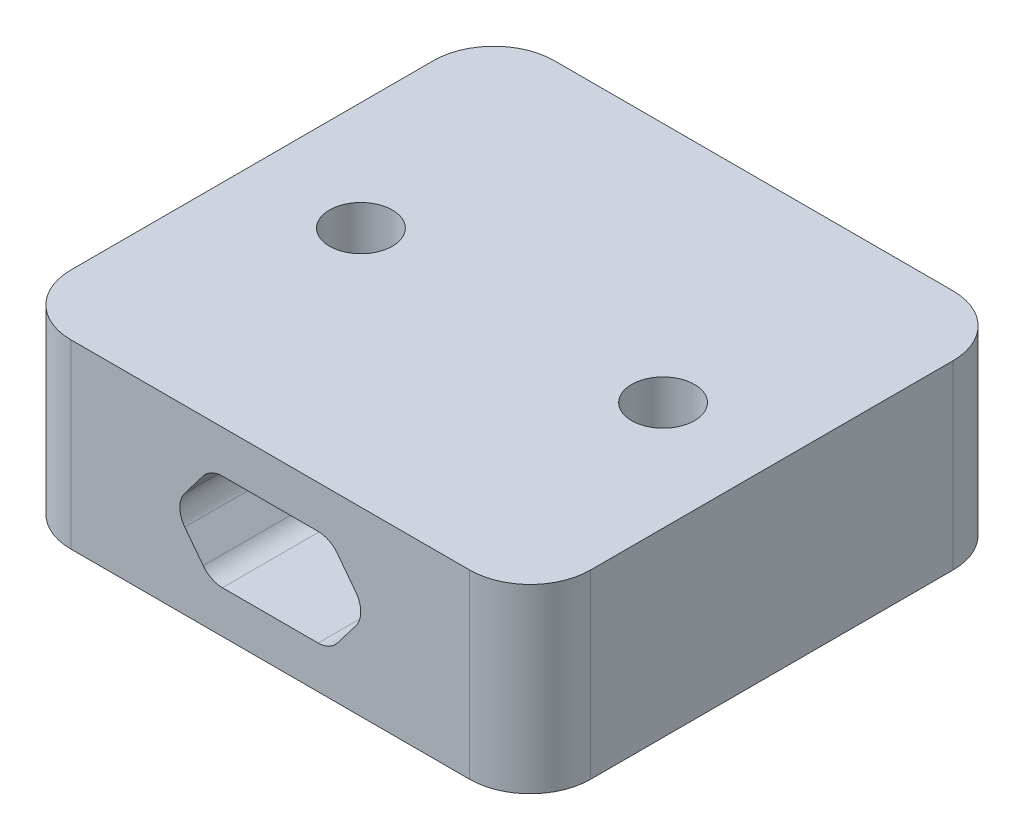
ISO-10303-21;
HEADER;
FILE_DESCRIPTION(('STEP AP214'),'2;1');
FILE_NAME('part.step','',(''),(''),'','','');
FILE_SCHEMA(('AUTOMOTIVE_DESIGN { 1 0 10303 214 1 1 1 1 }'));
ENDSEC;
DATA;
#1=APPLICATION_CONTEXT('core data for automotive mechanical design processes');
#2=APPLICATION_PROTOCOL_DEFINITION('international standard','automotive_design',2000,#1);
#3=PRODUCT_CONTEXT('',#1,'mechanical');
#4=PRODUCT('Part','Part','',(#3));
#5=PRODUCT_RELATED_PRODUCT_CATEGORY('part','',(#4));
#6=PRODUCT_DEFINITION_FORMATION('','',#4);
#7=PRODUCT_DEFINITION_CONTEXT('part definition',#1,'design');
#8=PRODUCT_DEFINITION('design','',#6,#7);
#9=PRODUCT_DEFINITION_SHAPE('','',#8);
#10=(LENGTH_UNIT() NAMED_UNIT(*) SI_UNIT(.MILLI.,.METRE.));
#11=(NAMED_UNIT(*) PLANE_ANGLE_UNIT() SI_UNIT($,.RADIAN.));
#12=(NAMED_UNIT(*) SI_UNIT($,.STERADIAN.) SOLID_ANGLE_UNIT());
#13=UNCERTAINTY_MEASURE_WITH_UNIT(LENGTH_MEASURE(1.E-05),#10,'distance_accuracy_value','');
#14=(GEOMETRIC_REPRESENTATION_CONTEXT(3) GLOBAL_UNCERTAINTY_ASSIGNED_CONTEXT((#13)) GLOBAL_UNIT_ASSIGNED_CONTEXT((#10,
#11,#12)) REPRESENTATION_CONTEXT('',''));
#15=CARTESIAN_POINT('',(0.,0.,0.));
#16=DIRECTION('',(0.,0.,1.));
#17=DIRECTION('',(1.,0.,0.));
#18=AXIS2_PLACEMENT_3D('',#15,#16,#17);
#19=CARTESIAN_POINT('',(0.,15.,0.));
#20=DIRECTION('',(1.,0.,0.));
#21=DIRECTION('',(0.,0.,-1.));
#22=AXIS2_PLACEMENT_3D('',#19,#20,#21);
#23=PLANE('',#22);
#24=DIRECTION('',(0.,0.,1.));
#25=VECTOR('',#24,1.);
#26=CARTESIAN_POINT('',(0.,15.,0.));
#27=LINE('',#26,#25);
#28=CARTESIAN_POINT('',(0.,15.,-35.));
#29=VERTEX_POINT('',#28);
#30=CARTESIAN_POINT('',(0.,15.,-5.));
#31=VERTEX_POINT('',#30);
#32=EDGE_CURVE('E219',#29,#31,#27,.T.);
#33=ORIENTED_EDGE('',*,*,#32,.F.);
#34=DIRECTION('',(0.,-1.,0.));
#35=VECTOR('',#34,1.);
#36=CARTESIAN_POINT('',(0.,15.,-35.));
#37=LINE('',#36,#35);
#38=CARTESIAN_POINT('',(0.,0.,-35.));
#39=VERTEX_POINT('',#38);
#40=EDGE_CURVE('E11',#29,#39,#37,.T.);
#41=ORIENTED_EDGE('',*,*,#40,.T.);
#42=DIRECTION('',(0.,0.,1.));
#43=VECTOR('',#42,1.);
#44=CARTESIAN_POINT('',(0.,0.,0.));
#45=LINE('',#44,#43);
#46=CARTESIAN_POINT('',(0.,0.,-5.));
#47=VERTEX_POINT('',#46);
#48=EDGE_CURVE('E230',#39,#47,#45,.T.);
#49=ORIENTED_EDGE('',*,*,#48,.T.);
#50=DIRECTION('',(0.,-1.,0.));
#51=VECTOR('',#50,1.);
#52=CARTESIAN_POINT('',(0.,15.,-5.));
#53=LINE('',#52,#51);
#54=EDGE_CURVE('E43',#47,#31,#53,.F.);
#55=ORIENTED_EDGE('',*,*,#54,.T.);
#56=EDGE_LOOP('',(#33,#41,#49,#55));
#57=FACE_BOUND('',#56,.T.);
#58=ADVANCED_FACE('F35',(#57),#23,.F.);
#59=CARTESIAN_POINT('',(0.,15.,0.));
#60=DIRECTION('',(0.,0.,-1.));
#61=DIRECTION('',(-1.,0.,0.));
#62=AXIS2_PLACEMENT_3D('',#59,#60,#61);
#63=PLANE('',#62);
#64=DIRECTION('',(1.,0.,0.));
#65=VECTOR('',#64,1.);
#66=CARTESIAN_POINT('',(16.55,3.5,0.));
#67=LINE('',#66,#65);
#68=CARTESIAN_POINT('',(17.5400795216056,3.5,0.));
#69=VERTEX_POINT('',#68);
#70=CARTESIAN_POINT('',(25.4599204783944,3.5,0.));
#71=VERTEX_POINT('',#70);
#72=EDGE_CURVE('E191',#69,#71,#67,.T.);
#73=ORIENTED_EDGE('',*,*,#72,.F.);
#74=CARTESIAN_POINT('',(17.5400795216056,5.5,0.));
#75=DIRECTION('',(0.,0.,-1.));
#76=DIRECTION('',(-1.,0.,0.));
#77=AXIS2_PLACEMENT_3D('',#74,#75,#76);
#78=CIRCLE('',#77,2.);
#79=CARTESIAN_POINT('',(15.9496725521089,4.28731468575877,0.));
#80=VERTEX_POINT('',#79);
#81=EDGE_CURVE('E174',#69,#80,#78,.T.);
#82=ORIENTED_EDGE('',*,*,#81,.T.);
#83=DIRECTION('',(0.606342657120614,-0.795203484748346,0.));
#84=VECTOR('',#83,1.);
#85=CARTESIAN_POINT('',(13.5,7.5,0.));
#86=LINE('',#85,#84);
#87=CARTESIAN_POINT('',(14.4246725521089,6.28731468575877,0.));
#88=VERTEX_POINT('',#87);
#89=EDGE_CURVE('E201',#88,#80,#86,.T.);
#90=ORIENTED_EDGE('',*,*,#89,.F.);
#91=CARTESIAN_POINT('',(16.0150795216056,7.5,0.));
#92=DIRECTION('',(0.,0.,-1.));
#93=DIRECTION('',(-1.,0.,0.));
#94=AXIS2_PLACEMENT_3D('',#91,#92,#93);
#95=CIRCLE('',#94,2.);
#96=CARTESIAN_POINT('',(14.4246725521089,8.71268531424123,0.));
#97=VERTEX_POINT('',#96);
#98=EDGE_CURVE('E286',#88,#97,#95,.T.);
#99=ORIENTED_EDGE('',*,*,#98,.T.);
#100=DIRECTION('',(-0.606342657120614,-0.795203484748346,0.));
#101=VECTOR('',#100,1.);
#102=CARTESIAN_POINT('',(13.5,7.5,0.));
#103=LINE('',#102,#101);
#104=CARTESIAN_POINT('',(15.9496725521089,10.7126853142412,0.));
#105=VERTEX_POINT('',#104);
#106=EDGE_CURVE('E215',#105,#97,#103,.T.);
#107=ORIENTED_EDGE('',*,*,#106,.F.);
#108=CARTESIAN_POINT('',(17.5400795216056,9.5,0.));
#109=DIRECTION('',(0.,0.,-1.));
#110=DIRECTION('',(-1.,0.,0.));
#111=AXIS2_PLACEMENT_3D('',#108,#109,#110);
#112=CIRCLE('',#111,2.);
#113=CARTESIAN_POINT('',(17.5400795216056,11.5,0.));
#114=VERTEX_POINT('',#113);
#115=EDGE_CURVE('E284',#105,#114,#112,.T.);
#116=ORIENTED_EDGE('',*,*,#115,.T.);
#117=DIRECTION('',(-1.,0.,0.));
#118=VECTOR('',#117,1.);
#119=CARTESIAN_POINT('',(16.55,11.5,0.));
#120=LINE('',#119,#118);
#121=CARTESIAN_POINT('',(25.4599204783944,11.5,0.));
#122=VERTEX_POINT('',#121);
#123=EDGE_CURVE('E212',#122,#114,#120,.T.);
#124=ORIENTED_EDGE('',*,*,#123,.F.);
#125=CARTESIAN_POINT('',(25.4599204783944,9.5,0.));
#126=DIRECTION('',(0.,0.,-1.));
#127=DIRECTION('',(-1.,0.,0.));
#128=AXIS2_PLACEMENT_3D('',#125,#126,#127);
#129=CIRCLE('',#128,2.);
#130=CARTESIAN_POINT('',(27.0503274478911,10.7126853142412,0.));
#131=VERTEX_POINT('',#130);
#132=EDGE_CURVE('E282',#122,#131,#129,.T.);
#133=ORIENTED_EDGE('',*,*,#132,.T.);
#134=DIRECTION('',(-0.606342657120614,0.795203484748346,0.));
#135=VECTOR('',#134,1.);
#136=CARTESIAN_POINT('',(29.5,7.5,0.));
#137=LINE('',#136,#135);
#138=CARTESIAN_POINT('',(28.5753274478911,8.71268531424123,0.));
#139=VERTEX_POINT('',#138);
#140=EDGE_CURVE('E204',#139,#131,#137,.T.);
#141=ORIENTED_EDGE('',*,*,#140,.F.);
#142=CARTESIAN_POINT('',(26.9849204783944,7.5,0.));
#143=DIRECTION('',(0.,0.,-1.));
#144=DIRECTION('',(-1.,0.,0.));
#145=AXIS2_PLACEMENT_3D('',#142,#143,#144);
#146=CIRCLE('',#145,2.);
#147=CARTESIAN_POINT('',(28.5753274478911,6.28731468575877,0.));
#148=VERTEX_POINT('',#147);
#149=EDGE_CURVE('E280',#139,#148,#146,.T.);
#150=ORIENTED_EDGE('',*,*,#149,.T.);
#151=DIRECTION('',(0.606342657120614,0.795203484748346,0.));
#152=VECTOR('',#151,1.);
#153=CARTESIAN_POINT('',(29.5,7.5,0.));
#154=LINE('',#153,#152);
#155=CARTESIAN_POINT('',(27.0503274478911,4.28731468575877,0.));
#156=VERTEX_POINT('',#155);
#157=EDGE_CURVE('E200',#156,#148,#154,.T.);
#158=ORIENTED_EDGE('',*,*,#157,.F.);
#159=CARTESIAN_POINT('',(25.4599204783944,5.5,0.));
#160=DIRECTION('',(0.,0.,-1.));
#161=DIRECTION('',(-1.,0.,0.));
#162=AXIS2_PLACEMENT_3D('',#159,#160,#161);
#163=CIRCLE('',#162,2.);
#164=EDGE_CURVE('E184',#156,#71,#163,.T.);
#165=ORIENTED_EDGE('',*,*,#164,.T.);
#166=EDGE_LOOP('',(#73,#82,#90,#99,#107,#116,#124,#133,#141,#150,#158,#165));
#167=FACE_BOUND('',#166,.T.);
#168=DIRECTION('',(1.,0.,0.));
#169=VECTOR('',#168,1.);
#170=CARTESIAN_POINT('',(0.,0.,0.));
#171=LINE('',#170,#169);
#172=CARTESIAN_POINT('',(5.,0.,0.));
#173=VERTEX_POINT('',#172);
#174=CARTESIAN_POINT('',(38.,0.,0.));
#175=VERTEX_POINT('',#174);
#176=EDGE_CURVE('E233',#173,#175,#171,.T.);
#177=ORIENTED_EDGE('',*,*,#176,.T.);
#178=DIRECTION('',(0.,-1.,0.));
#179=VECTOR('',#178,1.);
#180=CARTESIAN_POINT('',(38.,15.,0.));
#181=LINE('',#180,#179);
#182=CARTESIAN_POINT('',(38.,15.,0.));
#183=VERTEX_POINT('',#182);
#184=EDGE_CURVE('E50',#175,#183,#181,.F.);
#185=ORIENTED_EDGE('',*,*,#184,.T.);
#186=DIRECTION('',(1.,0.,0.));
#187=VECTOR('',#186,1.);
#188=CARTESIAN_POINT('',(0.,15.,0.));
#189=LINE('',#188,#187);
#190=CARTESIAN_POINT('',(5.,15.,0.));
#191=VERTEX_POINT('',#190);
#192=EDGE_CURVE('E221',#191,#183,#189,.T.);
#193=ORIENTED_EDGE('',*,*,#192,.F.);
#194=DIRECTION('',(0.,-1.,0.));
#195=VECTOR('',#194,1.);
#196=CARTESIAN_POINT('',(5.,15.,0.));
#197=LINE('',#196,#195);
#198=EDGE_CURVE('E313',#191,#173,#197,.T.);
#199=ORIENTED_EDGE('',*,*,#198,.T.);
#200=EDGE_LOOP('',(#177,#185,#193,#199));
#201=FACE_BOUND('',#200,.T.);
#202=ADVANCED_FACE('F198',(#167,#201),#63,.F.);
#203=CARTESIAN_POINT('',(43.,15.,0.));
#204=DIRECTION('',(-1.,0.,0.));
#205=DIRECTION('',(0.,0.,1.));
#206=AXIS2_PLACEMENT_3D('',#203,#204,#205);
#207=PLANE('',#206);
#208=DIRECTION('',(0.,0.,-1.));
#209=VECTOR('',#208,1.);
#210=CARTESIAN_POINT('',(43.,0.,0.));
#211=LINE('',#210,#209);
#212=CARTESIAN_POINT('',(43.,0.,-5.));
#213=VERTEX_POINT('',#212);
#214=CARTESIAN_POINT('',(43.,0.,-35.));
#215=VERTEX_POINT('',#214);
#216=EDGE_CURVE('E236',#213,#215,#211,.T.);
#217=ORIENTED_EDGE('',*,*,#216,.T.);
#218=DIRECTION('',(0.,-1.,0.));
#219=VECTOR('',#218,1.);
#220=CARTESIAN_POINT('',(43.,15.,-35.));
#221=LINE('',#220,#219);
#222=CARTESIAN_POINT('',(43.,15.,-35.));
#223=VERTEX_POINT('',#222);
#224=EDGE_CURVE('E304',#215,#223,#221,.F.);
#225=ORIENTED_EDGE('',*,*,#224,.T.);
#226=DIRECTION('',(0.,0.,-1.));
#227=VECTOR('',#226,1.);
#228=CARTESIAN_POINT('',(43.,15.,0.));
#229=LINE('',#228,#227);
#230=CARTESIAN_POINT('',(43.,15.,-5.));
#231=VERTEX_POINT('',#230);
#232=EDGE_CURVE('E224',#231,#223,#229,.T.);
#233=ORIENTED_EDGE('',*,*,#232,.F.);
#234=DIRECTION('',(0.,-1.,0.));
#235=VECTOR('',#234,1.);
#236=CARTESIAN_POINT('',(43.,15.,-5.));
#237=LINE('',#236,#235);
#238=EDGE_CURVE('E301',#231,#213,#237,.T.);
#239=ORIENTED_EDGE('',*,*,#238,.T.);
#240=EDGE_LOOP('',(#217,#225,#233,#239));
#241=FACE_BOUND('',#240,.T.);
#242=ADVANCED_FACE('F336',(#241),#207,.F.);
#243=CARTESIAN_POINT('',(0.,15.,-40.));
#244=DIRECTION('',(0.,0.,1.));
#245=DIRECTION('',(1.,0.,0.));
#246=AXIS2_PLACEMENT_3D('',#243,#244,#245);
#247=PLANE('',#246);
#248=CARTESIAN_POINT('',(21.5,7.5,-40.));
#249=DIRECTION('',(0.,0.,1.));
#250=DIRECTION('',(1.,0.,0.));
#251=AXIS2_PLACEMENT_3D('',#248,#249,#250);
#252=CIRCLE('',#251,3.);
#253=CARTESIAN_POINT('',(24.5,7.5,-40.));
#254=VERTEX_POINT('',#253);
#255=EDGE_CURVE('E243',#254,#254,#252,.T.);
#256=ORIENTED_EDGE('',*,*,#255,.T.);
#257=EDGE_LOOP('',(#256));
#258=FACE_BOUND('',#257,.T.);
#259=DIRECTION('',(-1.,0.,0.));
#260=VECTOR('',#259,1.);
#261=CARTESIAN_POINT('',(0.,15.,-40.));
#262=LINE('',#261,#260);
#263=CARTESIAN_POINT('',(38.,15.,-40.));
#264=VERTEX_POINT('',#263);
#265=CARTESIAN_POINT('',(5.,15.,-40.));
#266=VERTEX_POINT('',#265);
#267=EDGE_CURVE('E227',#264,#266,#262,.T.);
#268=ORIENTED_EDGE('',*,*,#267,.F.);
#269=DIRECTION('',(0.,-1.,0.));
#270=VECTOR('',#269,1.);
#271=CARTESIAN_POINT('',(38.,15.,-40.));
#272=LINE('',#271,#270);
#273=CARTESIAN_POINT('',(38.,0.,-40.));
#274=VERTEX_POINT('',#273);
#275=EDGE_CURVE('E290',#264,#274,#272,.T.);
#276=ORIENTED_EDGE('',*,*,#275,.T.);
#277=DIRECTION('',(-1.,0.,0.));
#278=VECTOR('',#277,1.);
#279=CARTESIAN_POINT('',(0.,0.,-40.));
#280=LINE('',#279,#278);
#281=CARTESIAN_POINT('',(5.,0.,-40.));
#282=VERTEX_POINT('',#281);
#283=EDGE_CURVE('E222',#274,#282,#280,.T.);
#284=ORIENTED_EDGE('',*,*,#283,.T.);
#285=DIRECTION('',(0.,-1.,0.));
#286=VECTOR('',#285,1.);
#287=CARTESIAN_POINT('',(5.,15.,-40.));
#288=LINE('',#287,#286);
#289=EDGE_CURVE('E288',#282,#266,#288,.F.);
#290=ORIENTED_EDGE('',*,*,#289,.T.);
#291=EDGE_LOOP('',(#268,#276,#284,#290));
#292=FACE_BOUND('',#291,.T.);
#293=ADVANCED_FACE('F344',(#258,#292),#247,.F.);
#294=CARTESIAN_POINT('',(0.,15.,0.));
#295=DIRECTION('',(0.,-1.,0.));
#296=DIRECTION('',(0.,0.,-1.));
#297=AXIS2_PLACEMENT_3D('',#294,#295,#296);
#298=PLANE('',#297);
#299=CARTESIAN_POINT('',(34.,15.,-20.));
#300=DIRECTION('',(0.,1.,0.));
#301=DIRECTION('',(0.,0.,1.));
#302=AXIS2_PLACEMENT_3D('',#299,#300,#301);
#303=CIRCLE('',#302,2.6);
#304=CARTESIAN_POINT('',(34.,15.,-17.4));
#305=VERTEX_POINT('',#304);
#306=EDGE_CURVE('E630',#305,#305,#303,.T.);
#307=ORIENTED_EDGE('',*,*,#306,.F.);
#308=EDGE_LOOP('',(#307));
#309=FACE_BOUND('',#308,.T.);
#310=CARTESIAN_POINT('',(9.,15.,-20.));
#311=DIRECTION('',(0.,1.,0.));
#312=DIRECTION('',(0.,0.,1.));
#313=AXIS2_PLACEMENT_3D('',#310,#311,#312);
#314=CIRCLE('',#313,2.6);
#315=CARTESIAN_POINT('',(9.,15.,-17.4));
#316=VERTEX_POINT('',#315);
#317=EDGE_CURVE('E587',#316,#316,#314,.T.);
#318=ORIENTED_EDGE('',*,*,#317,.F.);
#319=EDGE_LOOP('',(#318));
#320=FACE_BOUND('',#319,.T.);
#321=ORIENTED_EDGE('',*,*,#232,.T.);
#322=CARTESIAN_POINT('',(38.,15.,-35.));
#323=DIRECTION('',(0.,-1.,0.));
#324=DIRECTION('',(0.,0.,-1.));
#325=AXIS2_PLACEMENT_3D('',#322,#323,#324);
#326=CIRCLE('',#325,5.);
#327=EDGE_CURVE('E311',#223,#264,#326,.F.);
#328=ORIENTED_EDGE('',*,*,#327,.T.);
#329=ORIENTED_EDGE('',*,*,#267,.T.);
#330=CARTESIAN_POINT('',(5.,15.,-35.));
#331=DIRECTION('',(0.,-1.,0.));
#332=DIRECTION('',(0.,0.,-1.));
#333=AXIS2_PLACEMENT_3D('',#330,#331,#332);
#334=CIRCLE('',#333,5.);
#335=EDGE_CURVE('E307',#266,#29,#334,.F.);
#336=ORIENTED_EDGE('',*,*,#335,.T.);
#337=ORIENTED_EDGE('',*,*,#32,.T.);
#338=CARTESIAN_POINT('',(5.,15.,-5.));
#339=DIRECTION('',(0.,-1.,0.));
#340=DIRECTION('',(0.,0.,-1.));
#341=AXIS2_PLACEMENT_3D('',#338,#339,#340);
#342=CIRCLE('',#341,5.);
#343=EDGE_CURVE('E57',#31,#191,#342,.F.);
#344=ORIENTED_EDGE('',*,*,#343,.T.);
#345=ORIENTED_EDGE('',*,*,#192,.T.);
#346=CARTESIAN_POINT('',(38.,15.,-5.));
#347=DIRECTION('',(0.,-1.,0.));
#348=DIRECTION('',(0.,0.,-1.));
#349=AXIS2_PLACEMENT_3D('',#346,#347,#348);
#350=CIRCLE('',#349,5.);
#351=EDGE_CURVE('E309',#183,#231,#350,.F.);
#352=ORIENTED_EDGE('',*,*,#351,.T.);
#353=EDGE_LOOP('',(#321,#328,#329,#336,#337,#344,#345,#352));
#354=FACE_BOUND('',#353,.T.);
#355=ADVANCED_FACE('F322',(#309,#320,#354),#298,.F.);
#356=CARTESIAN_POINT('',(0.,0.,0.));
#357=DIRECTION('',(0.,-1.,0.));
#358=DIRECTION('',(0.,0.,-1.));
#359=AXIS2_PLACEMENT_3D('',#356,#357,#358);
#360=PLANE('',#359);
#361=CARTESIAN_POINT('',(34.,0.,-20.));
#362=DIRECTION('',(0.,1.,0.));
#363=DIRECTION('',(0.,0.,1.));
#364=AXIS2_PLACEMENT_3D('',#361,#362,#363);
#365=CIRCLE('',#364,2.6);
#366=CARTESIAN_POINT('',(34.,0.,-17.4));
#367=VERTEX_POINT('',#366);
#368=EDGE_CURVE('E632',#367,#367,#365,.T.);
#369=ORIENTED_EDGE('',*,*,#368,.T.);
#370=EDGE_LOOP('',(#369));
#371=FACE_BOUND('',#370,.T.);
#372=CARTESIAN_POINT('',(9.,0.,-20.));
#373=DIRECTION('',(0.,1.,0.));
#374=DIRECTION('',(0.,0.,1.));
#375=AXIS2_PLACEMENT_3D('',#372,#373,#374);
#376=CIRCLE('',#375,2.6);
#377=CARTESIAN_POINT('',(9.,0.,-17.4));
#378=VERTEX_POINT('',#377);
#379=EDGE_CURVE('E590',#378,#378,#376,.T.);
#380=ORIENTED_EDGE('',*,*,#379,.T.);
#381=EDGE_LOOP('',(#380));
#382=FACE_BOUND('',#381,.T.);
#383=ORIENTED_EDGE('',*,*,#283,.F.);
#384=CARTESIAN_POINT('',(38.,0.,-35.));
#385=DIRECTION('',(0.,-1.,0.));
#386=DIRECTION('',(0.,0.,-1.));
#387=AXIS2_PLACEMENT_3D('',#384,#385,#386);
#388=CIRCLE('',#387,5.);
#389=EDGE_CURVE('E299',#274,#215,#388,.T.);
#390=ORIENTED_EDGE('',*,*,#389,.T.);
#391=ORIENTED_EDGE('',*,*,#216,.F.);
#392=CARTESIAN_POINT('',(38.,0.,-5.));
#393=DIRECTION('',(0.,-1.,0.));
#394=DIRECTION('',(0.,0.,-1.));
#395=AXIS2_PLACEMENT_3D('',#392,#393,#394);
#396=CIRCLE('',#395,5.);
#397=EDGE_CURVE('E297',#213,#175,#396,.T.);
#398=ORIENTED_EDGE('',*,*,#397,.T.);
#399=ORIENTED_EDGE('',*,*,#176,.F.);
#400=CARTESIAN_POINT('',(5.,0.,-5.));
#401=DIRECTION('',(0.,-1.,0.));
#402=DIRECTION('',(0.,0.,-1.));
#403=AXIS2_PLACEMENT_3D('',#400,#401,#402);
#404=CIRCLE('',#403,5.);
#405=EDGE_CURVE('E293',#173,#47,#404,.T.);
#406=ORIENTED_EDGE('',*,*,#405,.T.);
#407=ORIENTED_EDGE('',*,*,#48,.F.);
#408=CARTESIAN_POINT('',(5.,0.,-35.));
#409=DIRECTION('',(0.,-1.,0.));
#410=DIRECTION('',(0.,0.,-1.));
#411=AXIS2_PLACEMENT_3D('',#408,#409,#410);
#412=CIRCLE('',#411,5.);
#413=EDGE_CURVE('E295',#39,#282,#412,.T.);
#414=ORIENTED_EDGE('',*,*,#413,.T.);
#415=EDGE_LOOP('',(#383,#390,#391,#398,#399,#406,#407,#414));
#416=FACE_BOUND('',#415,.T.);
#417=ADVANCED_FACE('F328',(#371,#382,#416),#360,.T.);
#418=CARTESIAN_POINT('',(13.5,7.5,-25.));
#419=DIRECTION('',(-0.795203484748346,-0.606342657120614,0.));
#420=DIRECTION('',(0.606342657120614,-0.795203484748346,0.));
#421=AXIS2_PLACEMENT_3D('',#418,#419,#420);
#422=PLANE('',#421);
#423=ORIENTED_EDGE('',*,*,#89,.T.);
#424=DIRECTION('',(0.,0.,1.));
#425=VECTOR('',#424,1.);
#426=CARTESIAN_POINT('',(15.9496725521089,4.28731468575877,-25.));
#427=LINE('',#426,#425);
#428=CARTESIAN_POINT('',(15.9496725521089,4.28731468575877,-25.));
#429=VERTEX_POINT('',#428);
#430=EDGE_CURVE('E179',#80,#429,#427,.F.);
#431=ORIENTED_EDGE('',*,*,#430,.T.);
#432=DIRECTION('',(0.606342657120614,-0.795203484748346,0.));
#433=VECTOR('',#432,1.);
#434=CARTESIAN_POINT('',(13.5,7.5,-25.));
#435=LINE('',#434,#433);
#436=CARTESIAN_POINT('',(14.4246725521089,6.28731468575877,-25.));
#437=VERTEX_POINT('',#436);
#438=EDGE_CURVE('E218',#437,#429,#435,.T.);
#439=ORIENTED_EDGE('',*,*,#438,.F.);
#440=DIRECTION('',(0.,0.,1.));
#441=VECTOR('',#440,1.);
#442=CARTESIAN_POINT('',(14.4246725521089,6.28731468575877,0.));
#443=LINE('',#442,#441);
#444=EDGE_CURVE('E195',#437,#88,#443,.T.);
#445=ORIENTED_EDGE('',*,*,#444,.T.);
#446=EDGE_LOOP('',(#423,#431,#439,#445));
#447=FACE_BOUND('',#446,.T.);
#448=ADVANCED_FACE('F517',(#447),#422,.F.);
#449=CARTESIAN_POINT('',(13.5,7.5,-25.));
#450=DIRECTION('',(-0.795203484748346,0.606342657120614,0.));
#451=DIRECTION('',(-0.606342657120614,-0.795203484748346,0.));
#452=AXIS2_PLACEMENT_3D('',#449,#450,#451);
#453=PLANE('',#452);
#454=DIRECTION('',(-0.606342657120614,-0.795203484748346,0.));
#455=VECTOR('',#454,1.);
#456=CARTESIAN_POINT('',(13.5,7.5,-25.));
#457=LINE('',#456,#455);
#458=CARTESIAN_POINT('',(15.9496725521089,10.7126853142412,-25.));
#459=VERTEX_POINT('',#458);
#460=CARTESIAN_POINT('',(14.4246725521089,8.71268531424123,-25.));
#461=VERTEX_POINT('',#460);
#462=EDGE_CURVE('E234',#459,#461,#457,.T.);
#463=ORIENTED_EDGE('',*,*,#462,.F.);
#464=DIRECTION('',(0.,0.,1.));
#465=VECTOR('',#464,1.);
#466=CARTESIAN_POINT('',(15.9496725521089,10.7126853142412,0.));
#467=LINE('',#466,#465);
#468=EDGE_CURVE('E185',#459,#105,#467,.T.);
#469=ORIENTED_EDGE('',*,*,#468,.T.);
#470=ORIENTED_EDGE('',*,*,#106,.T.);
#471=DIRECTION('',(0.,0.,1.));
#472=VECTOR('',#471,1.);
#473=CARTESIAN_POINT('',(14.4246725521089,8.71268531424123,-25.));
#474=LINE('',#473,#472);
#475=EDGE_CURVE('E275',#97,#461,#474,.F.);
#476=ORIENTED_EDGE('',*,*,#475,.T.);
#477=EDGE_LOOP('',(#463,#469,#470,#476));
#478=FACE_BOUND('',#477,.T.);
#479=ADVANCED_FACE('F508',(#478),#453,.F.);
#480=CARTESIAN_POINT('',(16.55,11.5,-25.));
#481=DIRECTION('',(0.,1.,0.));
#482=DIRECTION('',(0.,0.,1.));
#483=AXIS2_PLACEMENT_3D('',#480,#481,#482);
#484=PLANE('',#483);
#485=DIRECTION('',(-1.,0.,0.));
#486=VECTOR('',#485,1.);
#487=CARTESIAN_POINT('',(16.55,11.5,-25.));
#488=LINE('',#487,#486);
#489=CARTESIAN_POINT('',(25.4599204783944,11.5,-25.));
#490=VERTEX_POINT('',#489);
#491=CARTESIAN_POINT('',(17.5400795216056,11.5,-25.));
#492=VERTEX_POINT('',#491);
#493=EDGE_CURVE('E603',#490,#492,#488,.T.);
#494=ORIENTED_EDGE('',*,*,#493,.F.);
#495=DIRECTION('',(0.,0.,1.));
#496=VECTOR('',#495,1.);
#497=CARTESIAN_POINT('',(25.4599204783944,11.5,0.));
#498=LINE('',#497,#496);
#499=EDGE_CURVE('E272',#490,#122,#498,.T.);
#500=ORIENTED_EDGE('',*,*,#499,.T.);
#501=ORIENTED_EDGE('',*,*,#123,.T.);
#502=DIRECTION('',(0.,0.,1.));
#503=VECTOR('',#502,1.);
#504=CARTESIAN_POINT('',(17.5400795216056,11.5,-25.));
#505=LINE('',#504,#503);
#506=EDGE_CURVE('E270',#114,#492,#505,.F.);
#507=ORIENTED_EDGE('',*,*,#506,.T.);
#508=EDGE_LOOP('',(#494,#500,#501,#507));
#509=FACE_BOUND('',#508,.T.);
#510=ADVANCED_FACE('F499',(#509),#484,.F.);
#511=CARTESIAN_POINT('',(29.5,7.5,-25.));
#512=DIRECTION('',(0.795203484748346,0.606342657120614,0.));
#513=DIRECTION('',(-0.606342657120614,0.795203484748346,0.));
#514=AXIS2_PLACEMENT_3D('',#511,#512,#513);
#515=PLANE('',#514);
#516=DIRECTION('',(-0.606342657120614,0.795203484748346,0.));
#517=VECTOR('',#516,1.);
#518=CARTESIAN_POINT('',(29.5,7.5,-25.));
#519=LINE('',#518,#517);
#520=CARTESIAN_POINT('',(28.5753274478911,8.71268531424123,-25.));
#521=VERTEX_POINT('',#520);
#522=CARTESIAN_POINT('',(27.0503274478911,10.7126853142412,-25.));
#523=VERTEX_POINT('',#522);
#524=EDGE_CURVE('E600',#521,#523,#519,.T.);
#525=ORIENTED_EDGE('',*,*,#524,.F.);
#526=DIRECTION('',(0.,0.,1.));
#527=VECTOR('',#526,1.);
#528=CARTESIAN_POINT('',(28.5753274478911,8.71268531424123,0.));
#529=LINE('',#528,#527);
#530=EDGE_CURVE('E267',#521,#139,#529,.T.);
#531=ORIENTED_EDGE('',*,*,#530,.T.);
#532=ORIENTED_EDGE('',*,*,#140,.T.);
#533=DIRECTION('',(0.,0.,1.));
#534=VECTOR('',#533,1.);
#535=CARTESIAN_POINT('',(27.0503274478911,10.7126853142412,-25.));
#536=LINE('',#535,#534);
#537=EDGE_CURVE('E265',#131,#523,#536,.F.);
#538=ORIENTED_EDGE('',*,*,#537,.T.);
#539=EDGE_LOOP('',(#525,#531,#532,#538));
#540=FACE_BOUND('',#539,.T.);
#541=ADVANCED_FACE('F490',(#540),#515,.F.);
#542=CARTESIAN_POINT('',(29.5,7.5,-25.));
#543=DIRECTION('',(0.795203484748346,-0.606342657120614,0.));
#544=DIRECTION('',(0.606342657120614,0.795203484748346,0.));
#545=AXIS2_PLACEMENT_3D('',#542,#543,#544);
#546=PLANE('',#545);
#547=DIRECTION('',(0.606342657120614,0.795203484748346,0.));
#548=VECTOR('',#547,1.);
#549=CARTESIAN_POINT('',(29.5,7.5,-25.));
#550=LINE('',#549,#548);
#551=CARTESIAN_POINT('',(27.0503274478911,4.28731468575877,-25.));
#552=VERTEX_POINT('',#551);
#553=CARTESIAN_POINT('',(28.5753274478911,6.28731468575877,-25.));
#554=VERTEX_POINT('',#553);
#555=EDGE_CURVE('E597',#552,#554,#550,.T.);
#556=ORIENTED_EDGE('',*,*,#555,.F.);
#557=DIRECTION('',(0.,0.,1.));
#558=VECTOR('',#557,1.);
#559=CARTESIAN_POINT('',(27.0503274478911,4.28731468575877,0.));
#560=LINE('',#559,#558);
#561=EDGE_CURVE('E262',#552,#156,#560,.T.);
#562=ORIENTED_EDGE('',*,*,#561,.T.);
#563=ORIENTED_EDGE('',*,*,#157,.T.);
#564=DIRECTION('',(0.,0.,1.));
#565=VECTOR('',#564,1.);
#566=CARTESIAN_POINT('',(28.5753274478911,6.28731468575877,-25.));
#567=LINE('',#566,#565);
#568=EDGE_CURVE('E260',#148,#554,#567,.F.);
#569=ORIENTED_EDGE('',*,*,#568,.T.);
#570=EDGE_LOOP('',(#556,#562,#563,#569));
#571=FACE_BOUND('',#570,.T.);
#572=ADVANCED_FACE('F482',(#571),#546,.F.);
#573=CARTESIAN_POINT('',(16.55,3.5,-25.));
#574=DIRECTION('',(0.,-1.,0.));
#575=DIRECTION('',(0.,0.,-1.));
#576=AXIS2_PLACEMENT_3D('',#573,#574,#575);
#577=PLANE('',#576);
#578=DIRECTION('',(1.,0.,0.));
#579=VECTOR('',#578,1.);
#580=CARTESIAN_POINT('',(16.55,3.5,-25.));
#581=LINE('',#580,#579);
#582=CARTESIAN_POINT('',(17.5400795216056,3.5,-25.));
#583=VERTEX_POINT('',#582);
#584=CARTESIAN_POINT('',(25.4599204783944,3.5,-25.));
#585=VERTEX_POINT('',#584);
#586=EDGE_CURVE('E194',#583,#585,#581,.T.);
#587=ORIENTED_EDGE('',*,*,#586,.F.);
#588=DIRECTION('',(0.,0.,1.));
#589=VECTOR('',#588,1.);
#590=CARTESIAN_POINT('',(17.5400795216056,3.5,0.));
#591=LINE('',#590,#589);
#592=EDGE_CURVE('E178',#583,#69,#591,.T.);
#593=ORIENTED_EDGE('',*,*,#592,.T.);
#594=ORIENTED_EDGE('',*,*,#72,.T.);
#595=DIRECTION('',(0.,0.,1.));
#596=VECTOR('',#595,1.);
#597=CARTESIAN_POINT('',(25.4599204783944,3.5,-25.));
#598=LINE('',#597,#596);
#599=EDGE_CURVE('E196',#71,#585,#598,.F.);
#600=ORIENTED_EDGE('',*,*,#599,.T.);
#601=EDGE_LOOP('',(#587,#593,#594,#600));
#602=FACE_BOUND('',#601,.T.);
#603=ADVANCED_FACE('F190',(#602),#577,.F.);
#604=CARTESIAN_POINT('',(0.,0.,-25.));
#605=DIRECTION('',(0.,0.,-1.));
#606=DIRECTION('',(-1.,0.,0.));
#607=AXIS2_PLACEMENT_3D('',#604,#605,#606);
#608=PLANE('',#607);
#609=CARTESIAN_POINT('',(21.5,7.5,-25.));
#610=DIRECTION('',(0.,0.,-1.));
#611=DIRECTION('',(-1.,0.,0.));
#612=AXIS2_PLACEMENT_3D('',#609,#610,#611);
#613=CIRCLE('',#612,3.);
#614=CARTESIAN_POINT('',(18.5,7.5,-25.));
#615=VERTEX_POINT('',#614);
#616=EDGE_CURVE('E206',#615,#615,#613,.T.);
#617=ORIENTED_EDGE('',*,*,#616,.T.);
#618=EDGE_LOOP('',(#617));
#619=FACE_BOUND('',#618,.T.);
#620=ORIENTED_EDGE('',*,*,#438,.T.);
#621=CARTESIAN_POINT('',(17.5400795216056,5.5,-25.));
#622=DIRECTION('',(0.,0.,-1.));
#623=DIRECTION('',(-1.,0.,0.));
#624=AXIS2_PLACEMENT_3D('',#621,#622,#623);
#625=CIRCLE('',#624,2.);
#626=EDGE_CURVE('E258',#429,#583,#625,.F.);
#627=ORIENTED_EDGE('',*,*,#626,.T.);
#628=ORIENTED_EDGE('',*,*,#586,.T.);
#629=CARTESIAN_POINT('',(25.4599204783944,5.5,-25.));
#630=DIRECTION('',(0.,0.,-1.));
#631=DIRECTION('',(-1.,0.,0.));
#632=AXIS2_PLACEMENT_3D('',#629,#630,#631);
#633=CIRCLE('',#632,2.);
#634=EDGE_CURVE('E256',#585,#552,#633,.F.);
#635=ORIENTED_EDGE('',*,*,#634,.T.);
#636=ORIENTED_EDGE('',*,*,#555,.T.);
#637=CARTESIAN_POINT('',(26.9849204783944,7.5,-25.));
#638=DIRECTION('',(0.,0.,-1.));
#639=DIRECTION('',(-1.,0.,0.));
#640=AXIS2_PLACEMENT_3D('',#637,#638,#639);
#641=CIRCLE('',#640,2.);
#642=EDGE_CURVE('E254',#554,#521,#641,.F.);
#643=ORIENTED_EDGE('',*,*,#642,.T.);
#644=ORIENTED_EDGE('',*,*,#524,.T.);
#645=CARTESIAN_POINT('',(25.4599204783944,9.5,-25.));
#646=DIRECTION('',(0.,0.,-1.));
#647=DIRECTION('',(-1.,0.,0.));
#648=AXIS2_PLACEMENT_3D('',#645,#646,#647);
#649=CIRCLE('',#648,2.);
#650=EDGE_CURVE('E252',#523,#490,#649,.F.);
#651=ORIENTED_EDGE('',*,*,#650,.T.);
#652=ORIENTED_EDGE('',*,*,#493,.T.);
#653=CARTESIAN_POINT('',(17.5400795216056,9.5,-25.));
#654=DIRECTION('',(0.,0.,-1.));
#655=DIRECTION('',(-1.,0.,0.));
#656=AXIS2_PLACEMENT_3D('',#653,#654,#655);
#657=CIRCLE('',#656,2.);
#658=EDGE_CURVE('E250',#492,#459,#657,.F.);
#659=ORIENTED_EDGE('',*,*,#658,.T.);
#660=ORIENTED_EDGE('',*,*,#462,.T.);
#661=CARTESIAN_POINT('',(16.0150795216056,7.5,-25.));
#662=DIRECTION('',(0.,0.,-1.));
#663=DIRECTION('',(-1.,0.,0.));
#664=AXIS2_PLACEMENT_3D('',#661,#662,#663);
#665=CIRCLE('',#664,2.);
#666=EDGE_CURVE('E248',#461,#437,#665,.F.);
#667=ORIENTED_EDGE('',*,*,#666,.T.);
#668=EDGE_LOOP('',(#620,#627,#628,#635,#636,#643,#644,#651,#652,#659,#660,#667));
#669=FACE_BOUND('',#668,.T.);
#670=ADVANCED_FACE('F466',(#619,#669),#608,.F.);
#671=CARTESIAN_POINT('',(21.5,7.5,-40.));
#672=DIRECTION('',(0.,0.,1.));
#673=DIRECTION('',(1.,0.,0.));
#674=AXIS2_PLACEMENT_3D('',#671,#672,#673);
#675=CYLINDRICAL_SURFACE('',#674,3.);
#676=ORIENTED_EDGE('',*,*,#255,.F.);
#677=EDGE_LOOP('',(#676));
#678=FACE_BOUND('',#677,.T.);
#679=ORIENTED_EDGE('',*,*,#616,.F.);
#680=EDGE_LOOP('',(#679));
#681=FACE_BOUND('',#680,.T.);
#682=ADVANCED_FACE('F457',(#678,#681),#675,.F.);
#683=CARTESIAN_POINT('',(9.,15.,-20.));
#684=DIRECTION('',(0.,-1.,0.));
#685=DIRECTION('',(0.,0.,-1.));
#686=AXIS2_PLACEMENT_3D('',#683,#684,#685);
#687=CYLINDRICAL_SURFACE('',#686,2.6);
#688=ORIENTED_EDGE('',*,*,#317,.T.);
#689=EDGE_LOOP('',(#688));
#690=FACE_BOUND('',#689,.T.);
#691=ORIENTED_EDGE('',*,*,#379,.F.);
#692=EDGE_LOOP('',(#691));
#693=FACE_BOUND('',#692,.T.);
#694=ADVANCED_FACE('F447',(#690,#693),#687,.F.);
#695=CARTESIAN_POINT('',(34.,15.,-20.));
#696=DIRECTION('',(0.,-1.,0.));
#697=DIRECTION('',(0.,0.,-1.));
#698=AXIS2_PLACEMENT_3D('',#695,#696,#697);
#699=CYLINDRICAL_SURFACE('',#698,2.6);
#700=ORIENTED_EDGE('',*,*,#306,.T.);
#701=EDGE_LOOP('',(#700));
#702=FACE_BOUND('',#701,.T.);
#703=ORIENTED_EDGE('',*,*,#368,.F.);
#704=EDGE_LOOP('',(#703));
#705=FACE_BOUND('',#704,.T.);
#706=ADVANCED_FACE('F365',(#702,#705),#699,.F.);
#707=CARTESIAN_POINT('',(17.5400795216056,5.5,-25.));
#708=DIRECTION('',(0.,0.,-1.));
#709=DIRECTION('',(-1.,0.,0.));
#710=AXIS2_PLACEMENT_3D('',#707,#708,#709);
#711=CYLINDRICAL_SURFACE('',#710,2.);
#712=ORIENTED_EDGE('',*,*,#626,.F.);
#713=ORIENTED_EDGE('',*,*,#430,.F.);
#714=ORIENTED_EDGE('',*,*,#81,.F.);
#715=ORIENTED_EDGE('',*,*,#592,.F.);
#716=EDGE_LOOP('',(#712,#713,#714,#715));
#717=FACE_BOUND('',#716,.T.);
#718=ADVANCED_FACE('F177',(#717),#711,.F.);
#719=CARTESIAN_POINT('',(25.4599204783944,5.5,-25.));
#720=DIRECTION('',(0.,0.,-1.));
#721=DIRECTION('',(-1.,0.,0.));
#722=AXIS2_PLACEMENT_3D('',#719,#720,#721);
#723=CYLINDRICAL_SURFACE('',#722,2.);
#724=ORIENTED_EDGE('',*,*,#634,.F.);
#725=ORIENTED_EDGE('',*,*,#599,.F.);
#726=ORIENTED_EDGE('',*,*,#164,.F.);
#727=ORIENTED_EDGE('',*,*,#561,.F.);
#728=EDGE_LOOP('',(#724,#725,#726,#727));
#729=FACE_BOUND('',#728,.T.);
#730=ADVANCED_FACE('F364',(#729),#723,.F.);
#731=CARTESIAN_POINT('',(26.9849204783944,7.5,-25.));
#732=DIRECTION('',(0.,0.,-1.));
#733=DIRECTION('',(-1.,0.,0.));
#734=AXIS2_PLACEMENT_3D('',#731,#732,#733);
#735=CYLINDRICAL_SURFACE('',#734,2.);
#736=ORIENTED_EDGE('',*,*,#642,.F.);
#737=ORIENTED_EDGE('',*,*,#568,.F.);
#738=ORIENTED_EDGE('',*,*,#149,.F.);
#739=ORIENTED_EDGE('',*,*,#530,.F.);
#740=EDGE_LOOP('',(#736,#737,#738,#739));
#741=FACE_BOUND('',#740,.T.);
#742=ADVANCED_FACE('F368',(#741),#735,.F.);
#743=CARTESIAN_POINT('',(25.4599204783944,9.5,-25.));
#744=DIRECTION('',(0.,0.,-1.));
#745=DIRECTION('',(-1.,0.,0.));
#746=AXIS2_PLACEMENT_3D('',#743,#744,#745);
#747=CYLINDRICAL_SURFACE('',#746,2.);
#748=ORIENTED_EDGE('',*,*,#650,.F.);
#749=ORIENTED_EDGE('',*,*,#537,.F.);
#750=ORIENTED_EDGE('',*,*,#132,.F.);
#751=ORIENTED_EDGE('',*,*,#499,.F.);
#752=EDGE_LOOP('',(#748,#749,#750,#751));
#753=FACE_BOUND('',#752,.T.);
#754=ADVANCED_FACE('F372',(#753),#747,.F.);
#755=CARTESIAN_POINT('',(17.5400795216056,9.5,-25.));
#756=DIRECTION('',(0.,0.,-1.));
#757=DIRECTION('',(-1.,0.,0.));
#758=AXIS2_PLACEMENT_3D('',#755,#756,#757);
#759=CYLINDRICAL_SURFACE('',#758,2.);
#760=ORIENTED_EDGE('',*,*,#658,.F.);
#761=ORIENTED_EDGE('',*,*,#506,.F.);
#762=ORIENTED_EDGE('',*,*,#115,.F.);
#763=ORIENTED_EDGE('',*,*,#468,.F.);
#764=EDGE_LOOP('',(#760,#761,#762,#763));
#765=FACE_BOUND('',#764,.T.);
#766=ADVANCED_FACE('F376',(#765),#759,.F.);
#767=CARTESIAN_POINT('',(16.0150795216056,7.5,-25.));
#768=DIRECTION('',(0.,0.,-1.));
#769=DIRECTION('',(-1.,0.,0.));
#770=AXIS2_PLACEMENT_3D('',#767,#768,#769);
#771=CYLINDRICAL_SURFACE('',#770,2.);
#772=ORIENTED_EDGE('',*,*,#666,.F.);
#773=ORIENTED_EDGE('',*,*,#475,.F.);
#774=ORIENTED_EDGE('',*,*,#98,.F.);
#775=ORIENTED_EDGE('',*,*,#444,.F.);
#776=EDGE_LOOP('',(#772,#773,#774,#775));
#777=FACE_BOUND('',#776,.T.);
#778=ADVANCED_FACE('F380',(#777),#771,.F.);
#779=CARTESIAN_POINT('',(38.,15.,-35.));
#780=DIRECTION('',(0.,-1.,0.));
#781=DIRECTION('',(0.,0.,-1.));
#782=AXIS2_PLACEMENT_3D('',#779,#780,#781);
#783=CYLINDRICAL_SURFACE('',#782,5.);
#784=ORIENTED_EDGE('',*,*,#327,.F.);
#785=ORIENTED_EDGE('',*,*,#224,.F.);
#786=ORIENTED_EDGE('',*,*,#389,.F.);
#787=ORIENTED_EDGE('',*,*,#275,.F.);
#788=EDGE_LOOP('',(#784,#785,#786,#787));
#789=FACE_BOUND('',#788,.T.);
#790=ADVANCED_FACE('F342',(#789),#783,.T.);
#791=CARTESIAN_POINT('',(38.,15.,-5.));
#792=DIRECTION('',(0.,-1.,0.));
#793=DIRECTION('',(0.,0.,-1.));
#794=AXIS2_PLACEMENT_3D('',#791,#792,#793);
#795=CYLINDRICAL_SURFACE('',#794,5.);
#796=ORIENTED_EDGE('',*,*,#351,.F.);
#797=ORIENTED_EDGE('',*,*,#184,.F.);
#798=ORIENTED_EDGE('',*,*,#397,.F.);
#799=ORIENTED_EDGE('',*,*,#238,.F.);
#800=EDGE_LOOP('',(#796,#797,#798,#799));
#801=FACE_BOUND('',#800,.T.);
#802=ADVANCED_FACE('F333',(#801),#795,.T.);
#803=CARTESIAN_POINT('',(5.,15.,-35.));
#804=DIRECTION('',(0.,-1.,0.));
#805=DIRECTION('',(0.,0.,-1.));
#806=AXIS2_PLACEMENT_3D('',#803,#804,#805);
#807=CYLINDRICAL_SURFACE('',#806,5.);
#808=ORIENTED_EDGE('',*,*,#335,.F.);
#809=ORIENTED_EDGE('',*,*,#289,.F.);
#810=ORIENTED_EDGE('',*,*,#413,.F.);
#811=ORIENTED_EDGE('',*,*,#40,.F.);
#812=EDGE_LOOP('',(#808,#809,#810,#811));
#813=FACE_BOUND('',#812,.T.);
#814=ADVANCED_FACE('F347',(#813),#807,.T.);
#815=CARTESIAN_POINT('',(5.,15.,-5.));
#816=DIRECTION('',(0.,-1.,0.));
#817=DIRECTION('',(0.,0.,-1.));
#818=AXIS2_PLACEMENT_3D('',#815,#816,#817);
#819=CYLINDRICAL_SURFACE('',#818,5.);
#820=ORIENTED_EDGE('',*,*,#343,.F.);
#821=ORIENTED_EDGE('',*,*,#54,.F.);
#822=ORIENTED_EDGE('',*,*,#405,.F.);
#823=ORIENTED_EDGE('',*,*,#198,.F.);
#824=EDGE_LOOP('',(#820,#821,#822,#823));
#825=FACE_BOUND('',#824,.T.);
#826=ADVANCED_FACE('F37',(#825),#819,.T.);
#827=CLOSED_SHELL('',(#58,#202,#242,#293,#355,#417,#448,#479,#510,#541,#572,#603,#670,#682,#694,
#706,#718,#730,#742,#754,#766,#778,#790,#802,#814,#826));
#828=MANIFOLD_SOLID_BREP('B2',#827);
#829=ADVANCED_BREP_SHAPE_REPRESENTATION('',(#18,#828),#14);
#830=SHAPE_DEFINITION_REPRESENTATION(#9,#829);
ENDSEC;
END-ISO-10303-21;
